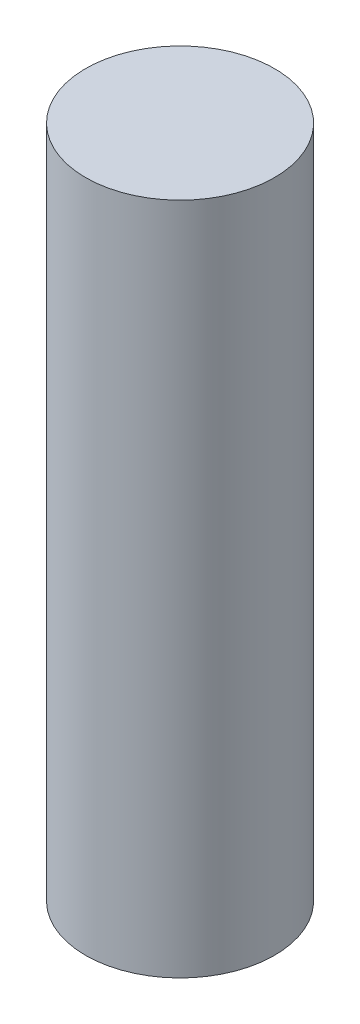
ISO-10303-21;
HEADER;
FILE_DESCRIPTION(('STEP AP214'),'2;1');
FILE_NAME('part.step','',(''),(''),'','','');
FILE_SCHEMA(('AUTOMOTIVE_DESIGN { 1 0 10303 214 1 1 1 1 }'));
ENDSEC;
DATA;
#1=APPLICATION_CONTEXT('core data for automotive mechanical design processes');
#2=APPLICATION_PROTOCOL_DEFINITION('international standard','automotive_design',2000,#1);
#3=PRODUCT_CONTEXT('',#1,'mechanical');
#4=PRODUCT('Part','Part','',(#3));
#5=PRODUCT_RELATED_PRODUCT_CATEGORY('part','',(#4));
#6=PRODUCT_DEFINITION_FORMATION('','',#4);
#7=PRODUCT_DEFINITION_CONTEXT('part definition',#1,'design');
#8=PRODUCT_DEFINITION('design','',#6,#7);
#9=PRODUCT_DEFINITION_SHAPE('','',#8);
#10=(LENGTH_UNIT() NAMED_UNIT(*) SI_UNIT(.MILLI.,.METRE.));
#11=(NAMED_UNIT(*) PLANE_ANGLE_UNIT() SI_UNIT($,.RADIAN.));
#12=(NAMED_UNIT(*) SI_UNIT($,.STERADIAN.) SOLID_ANGLE_UNIT());
#13=UNCERTAINTY_MEASURE_WITH_UNIT(LENGTH_MEASURE(1.E-05),#10,'distance_accuracy_value','');
#14=(GEOMETRIC_REPRESENTATION_CONTEXT(3) GLOBAL_UNCERTAINTY_ASSIGNED_CONTEXT((#13)) GLOBAL_UNIT_ASSIGNED_CONTEXT((#10,
#11,#12)) REPRESENTATION_CONTEXT('',''));
#15=CARTESIAN_POINT('',(0.,0.,0.));
#16=DIRECTION('',(0.,0.,1.));
#17=DIRECTION('',(1.,0.,0.));
#18=AXIS2_PLACEMENT_3D('',#15,#16,#17);
#19=CARTESIAN_POINT('',(0.,65.25,0.));
#20=DIRECTION('',(0.,-1.,0.));
#21=DIRECTION('',(0.,0.,-1.));
#22=AXIS2_PLACEMENT_3D('',#19,#20,#21);
#23=CYLINDRICAL_SURFACE('',#22,9.15);
#24=CARTESIAN_POINT('',(0.,65.25,0.));
#25=DIRECTION('',(0.,1.,0.));
#26=DIRECTION('',(0.,0.,1.));
#27=AXIS2_PLACEMENT_3D('',#24,#25,#26);
#28=CIRCLE('',#27,9.15);
#29=CARTESIAN_POINT('',(0.,65.25,9.15));
#30=VERTEX_POINT('',#29);
#31=EDGE_CURVE('E10',#30,#30,#28,.T.);
#32=ORIENTED_EDGE('',*,*,#31,.F.);
#33=EDGE_LOOP('',(#32));
#34=FACE_BOUND('',#33,.T.);
#35=CARTESIAN_POINT('',(0.,0.,0.));
#36=DIRECTION('',(0.,1.,0.));
#37=DIRECTION('',(0.,0.,1.));
#38=AXIS2_PLACEMENT_3D('',#35,#36,#37);
#39=CIRCLE('',#38,9.15);
#40=CARTESIAN_POINT('',(0.,0.,9.15));
#41=VERTEX_POINT('',#40);
#42=EDGE_CURVE('E44',#41,#41,#39,.T.);
#43=ORIENTED_EDGE('',*,*,#42,.T.);
#44=EDGE_LOOP('',(#43));
#45=FACE_BOUND('',#44,.T.);
#46=ADVANCED_FACE('F41',(#34,#45),#23,.T.);
#47=CARTESIAN_POINT('',(0.,65.25,0.));
#48=DIRECTION('',(0.,1.,0.));
#49=DIRECTION('',(0.,0.,1.));
#50=AXIS2_PLACEMENT_3D('',#47,#48,#49);
#51=PLANE('',#50);
#52=ORIENTED_EDGE('',*,*,#31,.T.);
#53=EDGE_LOOP('',(#52));
#54=FACE_BOUND('',#53,.T.);
#55=ADVANCED_FACE('F56',(#54),#51,.T.);
#56=CARTESIAN_POINT('',(0.,0.,0.));
#57=DIRECTION('',(0.,1.,0.));
#58=DIRECTION('',(0.,0.,1.));
#59=AXIS2_PLACEMENT_3D('',#56,#57,#58);
#60=PLANE('',#59);
#61=ORIENTED_EDGE('',*,*,#42,.F.);
#62=EDGE_LOOP('',(#61));
#63=FACE_BOUND('',#62,.T.);
#64=ADVANCED_FACE('F54',(#63),#60,.F.);
#65=CLOSED_SHELL('',(#46,#55,#64));
#66=MANIFOLD_SOLID_BREP('B2',#65);
#67=ADVANCED_BREP_SHAPE_REPRESENTATION('',(#18,#66),#14);
#68=SHAPE_DEFINITION_REPRESENTATION(#9,#67);
ENDSEC;
END-ISO-10303-21;
